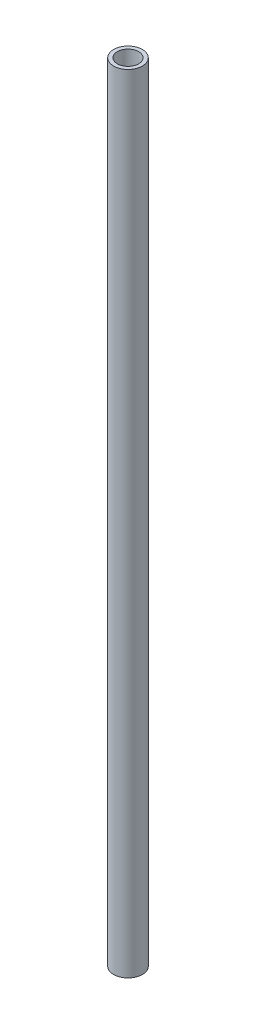
ISO-10303-21;
HEADER;
FILE_DESCRIPTION(('STEP AP214'),'2;1');
FILE_NAME('part.step','',(''),(''),'','','');
FILE_SCHEMA(('AUTOMOTIVE_DESIGN { 1 0 10303 214 1 1 1 1 }'));
ENDSEC;
DATA;
#1=APPLICATION_CONTEXT('core data for automotive mechanical design processes');
#2=APPLICATION_PROTOCOL_DEFINITION('international standard','automotive_design',2000,#1);
#3=PRODUCT_CONTEXT('',#1,'mechanical');
#4=PRODUCT('Part','Part','',(#3));
#5=PRODUCT_RELATED_PRODUCT_CATEGORY('part','',(#4));
#6=PRODUCT_DEFINITION_FORMATION('','',#4);
#7=PRODUCT_DEFINITION_CONTEXT('part definition',#1,'design');
#8=PRODUCT_DEFINITION('design','',#6,#7);
#9=PRODUCT_DEFINITION_SHAPE('','',#8);
#10=(LENGTH_UNIT() NAMED_UNIT(*) SI_UNIT(.MILLI.,.METRE.));
#11=(NAMED_UNIT(*) PLANE_ANGLE_UNIT() SI_UNIT($,.RADIAN.));
#12=(NAMED_UNIT(*) SI_UNIT($,.STERADIAN.) SOLID_ANGLE_UNIT());
#13=UNCERTAINTY_MEASURE_WITH_UNIT(LENGTH_MEASURE(1.E-05),#10,'distance_accuracy_value','');
#14=(GEOMETRIC_REPRESENTATION_CONTEXT(3) GLOBAL_UNCERTAINTY_ASSIGNED_CONTEXT((#13)) GLOBAL_UNIT_ASSIGNED_CONTEXT((#10,
#11,#12)) REPRESENTATION_CONTEXT('',''));
#15=CARTESIAN_POINT('',(0.,0.,0.));
#16=DIRECTION('',(0.,0.,1.));
#17=DIRECTION('',(1.,0.,0.));
#18=AXIS2_PLACEMENT_3D('',#15,#16,#17);
#19=CARTESIAN_POINT('',(0.,347.98,0.));
#20=DIRECTION('',(0.,1.,0.));
#21=DIRECTION('',(0.,0.,1.));
#22=AXIS2_PLACEMENT_3D('',#19,#20,#21);
#23=PLANE('',#22);
#24=CARTESIAN_POINT('',(0.,347.98,0.));
#25=DIRECTION('',(0.,1.,0.));
#26=DIRECTION('',(0.,0.,1.));
#27=AXIS2_PLACEMENT_3D('',#24,#25,#26);
#28=CIRCLE('',#27,6.35);
#29=CARTESIAN_POINT('',(0.,347.98,6.35));
#30=VERTEX_POINT('',#29);
#31=EDGE_CURVE('E10',#30,#30,#28,.T.);
#32=ORIENTED_EDGE('',*,*,#31,.T.);
#33=EDGE_LOOP('',(#32));
#34=FACE_BOUND('',#33,.T.);
#35=CARTESIAN_POINT('',(0.,347.98,0.));
#36=DIRECTION('',(0.,1.,0.));
#37=DIRECTION('',(0.,0.,1.));
#38=AXIS2_PLACEMENT_3D('',#35,#36,#37);
#39=CIRCLE('',#38,4.699);
#40=CARTESIAN_POINT('',(0.,347.98,4.699));
#41=VERTEX_POINT('',#40);
#42=EDGE_CURVE('E42',#41,#41,#39,.T.);
#43=ORIENTED_EDGE('',*,*,#42,.F.);
#44=EDGE_LOOP('',(#43));
#45=FACE_BOUND('',#44,.T.);
#46=ADVANCED_FACE('F31',(#34,#45),#23,.T.);
#47=CARTESIAN_POINT('',(0.,0.,0.));
#48=DIRECTION('',(0.,1.,0.));
#49=DIRECTION('',(0.,0.,1.));
#50=AXIS2_PLACEMENT_3D('',#47,#48,#49);
#51=PLANE('',#50);
#52=CARTESIAN_POINT('',(0.,0.,0.));
#53=DIRECTION('',(0.,1.,0.));
#54=DIRECTION('',(0.,0.,1.));
#55=AXIS2_PLACEMENT_3D('',#52,#53,#54);
#56=CIRCLE('',#55,6.35);
#57=CARTESIAN_POINT('',(0.,0.,6.35));
#58=VERTEX_POINT('',#57);
#59=EDGE_CURVE('E35',#58,#58,#56,.T.);
#60=ORIENTED_EDGE('',*,*,#59,.F.);
#61=EDGE_LOOP('',(#60));
#62=FACE_BOUND('',#61,.T.);
#63=CARTESIAN_POINT('',(0.,0.,0.));
#64=DIRECTION('',(0.,1.,0.));
#65=DIRECTION('',(0.,0.,1.));
#66=AXIS2_PLACEMENT_3D('',#63,#64,#65);
#67=CIRCLE('',#66,4.699);
#68=CARTESIAN_POINT('',(0.,0.,4.699));
#69=VERTEX_POINT('',#68);
#70=EDGE_CURVE('E44',#69,#69,#67,.T.);
#71=ORIENTED_EDGE('',*,*,#70,.T.);
#72=EDGE_LOOP('',(#71));
#73=FACE_BOUND('',#72,.T.);
#74=ADVANCED_FACE('F54',(#62,#73),#51,.F.);
#75=CARTESIAN_POINT('',(0.,347.98,0.));
#76=DIRECTION('',(0.,-1.,0.));
#77=DIRECTION('',(0.,0.,-1.));
#78=AXIS2_PLACEMENT_3D('',#75,#76,#77);
#79=CYLINDRICAL_SURFACE('',#78,6.35);
#80=ORIENTED_EDGE('',*,*,#31,.F.);
#81=EDGE_LOOP('',(#80));
#82=FACE_BOUND('',#81,.T.);
#83=ORIENTED_EDGE('',*,*,#59,.T.);
#84=EDGE_LOOP('',(#83));
#85=FACE_BOUND('',#84,.T.);
#86=ADVANCED_FACE('F33',(#82,#85),#79,.T.);
#87=CARTESIAN_POINT('',(0.,347.98,0.));
#88=DIRECTION('',(0.,-1.,0.));
#89=DIRECTION('',(0.,0.,-1.));
#90=AXIS2_PLACEMENT_3D('',#87,#88,#89);
#91=CYLINDRICAL_SURFACE('',#90,4.699);
#92=ORIENTED_EDGE('',*,*,#42,.T.);
#93=EDGE_LOOP('',(#92));
#94=FACE_BOUND('',#93,.T.);
#95=ORIENTED_EDGE('',*,*,#70,.F.);
#96=EDGE_LOOP('',(#95));
#97=FACE_BOUND('',#96,.T.);
#98=ADVANCED_FACE('F50',(#94,#97),#91,.F.);
#99=CLOSED_SHELL('',(#46,#74,#86,#98));
#100=MANIFOLD_SOLID_BREP('B2',#99);
#101=ADVANCED_BREP_SHAPE_REPRESENTATION('',(#18,#100),#14);
#102=SHAPE_DEFINITION_REPRESENTATION(#9,#101);
ENDSEC;
END-ISO-10303-21;
